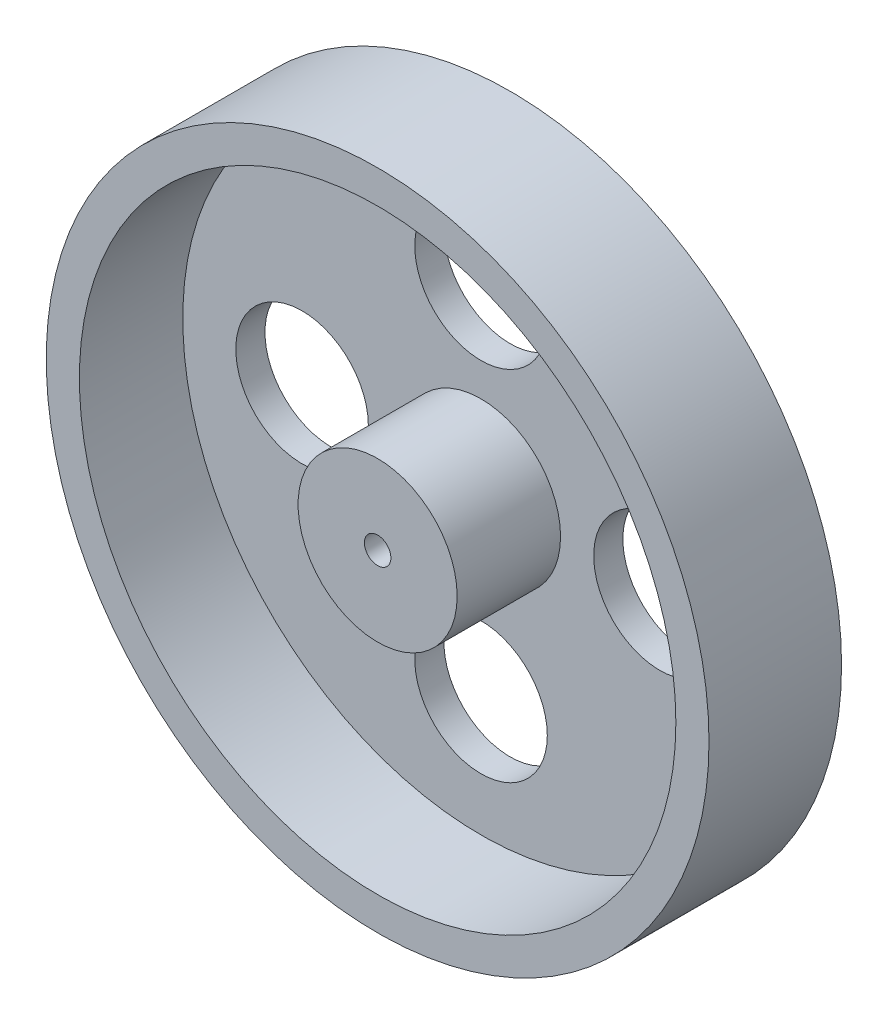
ISO-10303-21;
HEADER;
FILE_DESCRIPTION(('STEP AP214'),'2;1');
FILE_NAME('part.step','',(''),(''),'','','');
FILE_SCHEMA(('AUTOMOTIVE_DESIGN { 1 0 10303 214 1 1 1 1 }'));
ENDSEC;
DATA;
#1=APPLICATION_CONTEXT('core data for automotive mechanical design processes');
#2=APPLICATION_PROTOCOL_DEFINITION('international standard','automotive_design',2000,#1);
#3=PRODUCT_CONTEXT('',#1,'mechanical');
#4=PRODUCT('Part','Part','',(#3));
#5=PRODUCT_RELATED_PRODUCT_CATEGORY('part','',(#4));
#6=PRODUCT_DEFINITION_FORMATION('','',#4);
#7=PRODUCT_DEFINITION_CONTEXT('part definition',#1,'design');
#8=PRODUCT_DEFINITION('design','',#6,#7);
#9=PRODUCT_DEFINITION_SHAPE('','',#8);
#10=(LENGTH_UNIT() NAMED_UNIT(*) SI_UNIT(.MILLI.,.METRE.));
#11=(NAMED_UNIT(*) PLANE_ANGLE_UNIT() SI_UNIT($,.RADIAN.));
#12=(NAMED_UNIT(*) SI_UNIT($,.STERADIAN.) SOLID_ANGLE_UNIT());
#13=UNCERTAINTY_MEASURE_WITH_UNIT(LENGTH_MEASURE(1.E-05),#10,'distance_accuracy_value','');
#14=(GEOMETRIC_REPRESENTATION_CONTEXT(3) GLOBAL_UNCERTAINTY_ASSIGNED_CONTEXT((#13)) GLOBAL_UNIT_ASSIGNED_CONTEXT((#10,
#11,#12)) REPRESENTATION_CONTEXT('',''));
#15=CARTESIAN_POINT('',(0.,0.,0.));
#16=DIRECTION('',(0.,0.,1.));
#17=DIRECTION('',(1.,0.,0.));
#18=AXIS2_PLACEMENT_3D('',#15,#16,#17);
#19=CARTESIAN_POINT('',(0.,0.,2.2));
#20=DIRECTION('',(0.,0.,-1.));
#21=DIRECTION('',(-1.,0.,0.));
#22=AXIS2_PLACEMENT_3D('',#19,#20,#21);
#23=CYLINDRICAL_SURFACE('',#22,25.);
#24=CARTESIAN_POINT('',(0.,0.,0.));
#25=DIRECTION('',(0.,0.,1.));
#26=DIRECTION('',(1.,0.,0.));
#27=AXIS2_PLACEMENT_3D('',#24,#25,#26);
#28=CIRCLE('',#27,25.);
#29=CARTESIAN_POINT('',(25.,0.,0.));
#30=VERTEX_POINT('',#29);
#31=EDGE_CURVE('E44',#30,#30,#28,.T.);
#32=ORIENTED_EDGE('',*,*,#31,.T.);
#33=EDGE_LOOP('',(#32));
#34=FACE_BOUND('',#33,.T.);
#35=CARTESIAN_POINT('',(0.,0.,10.));
#36=DIRECTION('',(0.,0.,1.));
#37=DIRECTION('',(1.,0.,0.));
#38=AXIS2_PLACEMENT_3D('',#35,#36,#37);
#39=CIRCLE('',#38,25.);
#40=CARTESIAN_POINT('',(25.,0.,10.));
#41=VERTEX_POINT('',#40);
#42=EDGE_CURVE('E49',#41,#41,#39,.T.);
#43=ORIENTED_EDGE('',*,*,#42,.F.);
#44=EDGE_LOOP('',(#43));
#45=FACE_BOUND('',#44,.T.);
#46=ADVANCED_FACE('F37',(#34,#45),#23,.T.);
#47=CARTESIAN_POINT('',(0.,0.,0.));
#48=DIRECTION('',(0.,0.,1.));
#49=DIRECTION('',(1.,0.,0.));
#50=AXIS2_PLACEMENT_3D('',#47,#48,#49);
#51=PLANE('',#50);
#52=CARTESIAN_POINT('',(0.,13.5,0.));
#53=DIRECTION('',(0.,0.,1.));
#54=DIRECTION('',(1.,0.,0.));
#55=AXIS2_PLACEMENT_3D('',#52,#53,#54);
#56=CIRCLE('',#55,5.);
#57=CARTESIAN_POINT('',(5.,13.5,0.));
#58=VERTEX_POINT('',#57);
#59=EDGE_CURVE('E67',#58,#58,#56,.F.);
#60=ORIENTED_EDGE('',*,*,#59,.F.);
#61=EDGE_LOOP('',(#60));
#62=FACE_BOUND('',#61,.T.);
#63=CARTESIAN_POINT('',(0.,-13.5,0.));
#64=DIRECTION('',(0.,0.,1.));
#65=DIRECTION('',(1.,0.,0.));
#66=AXIS2_PLACEMENT_3D('',#63,#64,#65);
#67=CIRCLE('',#66,5.);
#68=CARTESIAN_POINT('',(5.,-13.5,0.));
#69=VERTEX_POINT('',#68);
#70=EDGE_CURVE('E64',#69,#69,#67,.F.);
#71=ORIENTED_EDGE('',*,*,#70,.F.);
#72=EDGE_LOOP('',(#71));
#73=FACE_BOUND('',#72,.T.);
#74=CARTESIAN_POINT('',(13.5,0.,0.));
#75=DIRECTION('',(0.,0.,1.));
#76=DIRECTION('',(1.,0.,0.));
#77=AXIS2_PLACEMENT_3D('',#74,#75,#76);
#78=CIRCLE('',#77,5.);
#79=CARTESIAN_POINT('',(18.5,0.,0.));
#80=VERTEX_POINT('',#79);
#81=EDGE_CURVE('E61',#80,#80,#78,.F.);
#82=ORIENTED_EDGE('',*,*,#81,.F.);
#83=EDGE_LOOP('',(#82));
#84=FACE_BOUND('',#83,.T.);
#85=CARTESIAN_POINT('',(-13.5,0.,0.));
#86=DIRECTION('',(0.,0.,1.));
#87=DIRECTION('',(1.,0.,0.));
#88=AXIS2_PLACEMENT_3D('',#85,#86,#87);
#89=CIRCLE('',#88,5.);
#90=CARTESIAN_POINT('',(-8.5,0.,0.));
#91=VERTEX_POINT('',#90);
#92=EDGE_CURVE('E57',#91,#91,#89,.F.);
#93=ORIENTED_EDGE('',*,*,#92,.F.);
#94=EDGE_LOOP('',(#93));
#95=FACE_BOUND('',#94,.T.);
#96=CARTESIAN_POINT('',(0.,0.,0.));
#97=DIRECTION('',(0.,0.,1.));
#98=DIRECTION('',(1.,0.,0.));
#99=AXIS2_PLACEMENT_3D('',#96,#97,#98);
#100=CIRCLE('',#99,1.);
#101=CARTESIAN_POINT('',(1.,0.,0.));
#102=VERTEX_POINT('',#101);
#103=EDGE_CURVE('E56',#102,#102,#100,.F.);
#104=ORIENTED_EDGE('',*,*,#103,.F.);
#105=EDGE_LOOP('',(#104));
#106=FACE_BOUND('',#105,.T.);
#107=ORIENTED_EDGE('',*,*,#31,.F.);
#108=EDGE_LOOP('',(#107));
#109=FACE_BOUND('',#108,.T.);
#110=ADVANCED_FACE('F99',(#62,#73,#84,#95,#106,#109),#51,.F.);
#111=CARTESIAN_POINT('',(0.,0.,10.));
#112=DIRECTION('',(0.,0.,1.));
#113=DIRECTION('',(1.,0.,0.));
#114=AXIS2_PLACEMENT_3D('',#111,#112,#113);
#115=PLANE('',#114);
#116=ORIENTED_EDGE('',*,*,#42,.T.);
#117=EDGE_LOOP('',(#116));
#118=FACE_BOUND('',#117,.T.);
#119=CARTESIAN_POINT('',(0.,0.,10.));
#120=DIRECTION('',(0.,0.,1.));
#121=DIRECTION('',(1.,0.,0.));
#122=AXIS2_PLACEMENT_3D('',#119,#120,#121);
#123=CIRCLE('',#122,22.5);
#124=CARTESIAN_POINT('',(22.5,0.,10.));
#125=VERTEX_POINT('',#124);
#126=EDGE_CURVE('E88',#125,#125,#123,.T.);
#127=ORIENTED_EDGE('',*,*,#126,.F.);
#128=EDGE_LOOP('',(#127));
#129=FACE_BOUND('',#128,.T.);
#130=ADVANCED_FACE('F95',(#118,#129),#115,.T.);
#131=CARTESIAN_POINT('',(0.,0.,10.));
#132=DIRECTION('',(0.,0.,-1.));
#133=DIRECTION('',(-1.,0.,0.));
#134=AXIS2_PLACEMENT_3D('',#131,#132,#133);
#135=CYLINDRICAL_SURFACE('',#134,22.5);
#136=ORIENTED_EDGE('',*,*,#126,.T.);
#137=EDGE_LOOP('',(#136));
#138=FACE_BOUND('',#137,.T.);
#139=CARTESIAN_POINT('',(0.,0.,2.2));
#140=DIRECTION('',(0.,0.,1.));
#141=DIRECTION('',(1.,0.,0.));
#142=AXIS2_PLACEMENT_3D('',#139,#140,#141);
#143=CIRCLE('',#142,22.5);
#144=CARTESIAN_POINT('',(22.5,0.,2.2));
#145=VERTEX_POINT('',#144);
#146=EDGE_CURVE('E10',#145,#145,#143,.F.);
#147=ORIENTED_EDGE('',*,*,#146,.T.);
#148=EDGE_LOOP('',(#147));
#149=FACE_BOUND('',#148,.T.);
#150=ADVANCED_FACE('F112',(#138,#149),#135,.F.);
#151=CARTESIAN_POINT('',(0.,0.,2.2));
#152=DIRECTION('',(0.,0.,1.));
#153=DIRECTION('',(1.,0.,0.));
#154=AXIS2_PLACEMENT_3D('',#151,#152,#153);
#155=PLANE('',#154);
#156=CARTESIAN_POINT('',(0.,13.5,2.2));
#157=DIRECTION('',(0.,0.,1.));
#158=DIRECTION('',(1.,0.,0.));
#159=AXIS2_PLACEMENT_3D('',#156,#157,#158);
#160=CIRCLE('',#159,5.);
#161=CARTESIAN_POINT('',(5.,13.5,2.2));
#162=VERTEX_POINT('',#161);
#163=EDGE_CURVE('E40',#162,#162,#160,.F.);
#164=ORIENTED_EDGE('',*,*,#163,.T.);
#165=EDGE_LOOP('',(#164));
#166=FACE_BOUND('',#165,.T.);
#167=CARTESIAN_POINT('',(0.,-13.5,2.2));
#168=DIRECTION('',(0.,0.,1.));
#169=DIRECTION('',(1.,0.,0.));
#170=AXIS2_PLACEMENT_3D('',#167,#168,#169);
#171=CIRCLE('',#170,5.);
#172=CARTESIAN_POINT('',(5.,-13.5,2.2));
#173=VERTEX_POINT('',#172);
#174=EDGE_CURVE('E65',#173,#173,#171,.F.);
#175=ORIENTED_EDGE('',*,*,#174,.T.);
#176=EDGE_LOOP('',(#175));
#177=FACE_BOUND('',#176,.T.);
#178=CARTESIAN_POINT('',(13.5,0.,2.2));
#179=DIRECTION('',(0.,0.,1.));
#180=DIRECTION('',(1.,0.,0.));
#181=AXIS2_PLACEMENT_3D('',#178,#179,#180);
#182=CIRCLE('',#181,5.);
#183=CARTESIAN_POINT('',(18.5,0.,2.2));
#184=VERTEX_POINT('',#183);
#185=EDGE_CURVE('E62',#184,#184,#182,.F.);
#186=ORIENTED_EDGE('',*,*,#185,.T.);
#187=EDGE_LOOP('',(#186));
#188=FACE_BOUND('',#187,.T.);
#189=CARTESIAN_POINT('',(-13.5,0.,2.2));
#190=DIRECTION('',(0.,0.,1.));
#191=DIRECTION('',(1.,0.,0.));
#192=AXIS2_PLACEMENT_3D('',#189,#190,#191);
#193=CIRCLE('',#192,5.);
#194=CARTESIAN_POINT('',(-8.5,0.,2.2));
#195=VERTEX_POINT('',#194);
#196=EDGE_CURVE('E58',#195,#195,#193,.F.);
#197=ORIENTED_EDGE('',*,*,#196,.T.);
#198=EDGE_LOOP('',(#197));
#199=FACE_BOUND('',#198,.T.);
#200=CARTESIAN_POINT('',(0.,0.,2.2));
#201=DIRECTION('',(0.,0.,1.));
#202=DIRECTION('',(1.,0.,0.));
#203=AXIS2_PLACEMENT_3D('',#200,#201,#202);
#204=CIRCLE('',#203,6.);
#205=CARTESIAN_POINT('',(6.,0.,2.2));
#206=VERTEX_POINT('',#205);
#207=EDGE_CURVE('E84',#206,#206,#204,.T.);
#208=ORIENTED_EDGE('',*,*,#207,.F.);
#209=EDGE_LOOP('',(#208));
#210=FACE_BOUND('',#209,.T.);
#211=ORIENTED_EDGE('',*,*,#146,.F.);
#212=EDGE_LOOP('',(#211));
#213=FACE_BOUND('',#212,.T.);
#214=ADVANCED_FACE('F116',(#166,#177,#188,#199,#210,#213),#155,.T.);
#215=CARTESIAN_POINT('',(0.,0.,10.));
#216=DIRECTION('',(0.,0.,-1.));
#217=DIRECTION('',(-1.,0.,0.));
#218=AXIS2_PLACEMENT_3D('',#215,#216,#217);
#219=CYLINDRICAL_SURFACE('',#218,6.);
#220=CARTESIAN_POINT('',(0.,0.,10.));
#221=DIRECTION('',(0.,0.,1.));
#222=DIRECTION('',(1.,0.,0.));
#223=AXIS2_PLACEMENT_3D('',#220,#221,#222);
#224=CIRCLE('',#223,6.);
#225=CARTESIAN_POINT('',(6.,0.,10.));
#226=VERTEX_POINT('',#225);
#227=EDGE_CURVE('E85',#226,#226,#224,.T.);
#228=ORIENTED_EDGE('',*,*,#227,.F.);
#229=EDGE_LOOP('',(#228));
#230=FACE_BOUND('',#229,.T.);
#231=ORIENTED_EDGE('',*,*,#207,.T.);
#232=EDGE_LOOP('',(#231));
#233=FACE_BOUND('',#232,.T.);
#234=ADVANCED_FACE('F117',(#230,#233),#219,.T.);
#235=CARTESIAN_POINT('',(0.,0.,10.));
#236=DIRECTION('',(0.,0.,1.));
#237=DIRECTION('',(1.,0.,0.));
#238=AXIS2_PLACEMENT_3D('',#235,#236,#237);
#239=PLANE('',#238);
#240=CARTESIAN_POINT('',(0.,0.,10.));
#241=DIRECTION('',(0.,0.,1.));
#242=DIRECTION('',(1.,0.,0.));
#243=AXIS2_PLACEMENT_3D('',#240,#241,#242);
#244=CIRCLE('',#243,1.);
#245=CARTESIAN_POINT('',(1.,0.,10.));
#246=VERTEX_POINT('',#245);
#247=EDGE_CURVE('E53',#246,#246,#244,.F.);
#248=ORIENTED_EDGE('',*,*,#247,.T.);
#249=EDGE_LOOP('',(#248));
#250=FACE_BOUND('',#249,.T.);
#251=ORIENTED_EDGE('',*,*,#227,.T.);
#252=EDGE_LOOP('',(#251));
#253=FACE_BOUND('',#252,.T.);
#254=ADVANCED_FACE('F125',(#250,#253),#239,.T.);
#255=CARTESIAN_POINT('',(0.,0.,10.1));
#256=DIRECTION('',(0.,0.,-1.));
#257=DIRECTION('',(-1.,0.,0.));
#258=AXIS2_PLACEMENT_3D('',#255,#256,#257);
#259=CYLINDRICAL_SURFACE('',#258,1.);
#260=ORIENTED_EDGE('',*,*,#247,.F.);
#261=EDGE_LOOP('',(#260));
#262=FACE_BOUND('',#261,.T.);
#263=ORIENTED_EDGE('',*,*,#103,.T.);
#264=EDGE_LOOP('',(#263));
#265=FACE_BOUND('',#264,.T.);
#266=ADVANCED_FACE('F129',(#262,#265),#259,.F.);
#267=CARTESIAN_POINT('',(-13.5,0.,10.1));
#268=DIRECTION('',(0.,0.,-1.));
#269=DIRECTION('',(-1.,0.,0.));
#270=AXIS2_PLACEMENT_3D('',#267,#268,#269);
#271=CYLINDRICAL_SURFACE('',#270,5.);
#272=ORIENTED_EDGE('',*,*,#196,.F.);
#273=EDGE_LOOP('',(#272));
#274=FACE_BOUND('',#273,.T.);
#275=ORIENTED_EDGE('',*,*,#92,.T.);
#276=EDGE_LOOP('',(#275));
#277=FACE_BOUND('',#276,.T.);
#278=ADVANCED_FACE('F133',(#274,#277),#271,.F.);
#279=CARTESIAN_POINT('',(13.5,0.,10.1));
#280=DIRECTION('',(0.,0.,-1.));
#281=DIRECTION('',(-1.,0.,0.));
#282=AXIS2_PLACEMENT_3D('',#279,#280,#281);
#283=CYLINDRICAL_SURFACE('',#282,5.);
#284=ORIENTED_EDGE('',*,*,#185,.F.);
#285=EDGE_LOOP('',(#284));
#286=FACE_BOUND('',#285,.T.);
#287=ORIENTED_EDGE('',*,*,#81,.T.);
#288=EDGE_LOOP('',(#287));
#289=FACE_BOUND('',#288,.T.);
#290=ADVANCED_FACE('F137',(#286,#289),#283,.F.);
#291=CARTESIAN_POINT('',(0.,-13.5,10.1));
#292=DIRECTION('',(0.,0.,-1.));
#293=DIRECTION('',(-1.,0.,0.));
#294=AXIS2_PLACEMENT_3D('',#291,#292,#293);
#295=CYLINDRICAL_SURFACE('',#294,5.);
#296=ORIENTED_EDGE('',*,*,#174,.F.);
#297=EDGE_LOOP('',(#296));
#298=FACE_BOUND('',#297,.T.);
#299=ORIENTED_EDGE('',*,*,#70,.T.);
#300=EDGE_LOOP('',(#299));
#301=FACE_BOUND('',#300,.T.);
#302=ADVANCED_FACE('F141',(#298,#301),#295,.F.);
#303=CARTESIAN_POINT('',(0.,13.5,10.1));
#304=DIRECTION('',(0.,0.,-1.));
#305=DIRECTION('',(-1.,0.,0.));
#306=AXIS2_PLACEMENT_3D('',#303,#304,#305);
#307=CYLINDRICAL_SURFACE('',#306,5.);
#308=ORIENTED_EDGE('',*,*,#163,.F.);
#309=EDGE_LOOP('',(#308));
#310=FACE_BOUND('',#309,.T.);
#311=ORIENTED_EDGE('',*,*,#59,.T.);
#312=EDGE_LOOP('',(#311));
#313=FACE_BOUND('',#312,.T.);
#314=ADVANCED_FACE('F144',(#310,#313),#307,.F.);
#315=CLOSED_SHELL('',(#46,#110,#130,#150,#214,#234,#254,#266,#278,#290,#302,#314));
#316=MANIFOLD_SOLID_BREP('B2',#315);
#317=ADVANCED_BREP_SHAPE_REPRESENTATION('',(#18,#316),#14);
#318=SHAPE_DEFINITION_REPRESENTATION(#9,#317);
ENDSEC;
END-ISO-10303-21;
